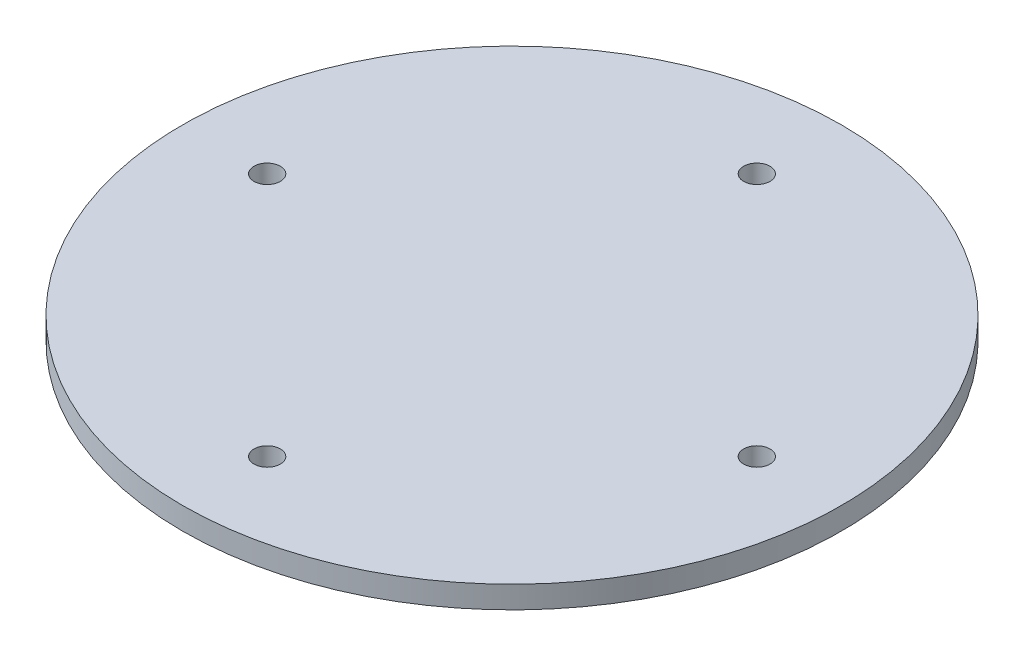
ISO-10303-21;
HEADER;
FILE_DESCRIPTION(('STEP AP214'),'2;1');
FILE_NAME('part.step','',(''),(''),'','','');
FILE_SCHEMA(('AUTOMOTIVE_DESIGN { 1 0 10303 214 1 1 1 1 }'));
ENDSEC;
DATA;
#1=APPLICATION_CONTEXT('core data for automotive mechanical design processes');
#2=APPLICATION_PROTOCOL_DEFINITION('international standard','automotive_design',2000,#1);
#3=PRODUCT_CONTEXT('',#1,'mechanical');
#4=PRODUCT('Part','Part','',(#3));
#5=PRODUCT_RELATED_PRODUCT_CATEGORY('part','',(#4));
#6=PRODUCT_DEFINITION_FORMATION('','',#4);
#7=PRODUCT_DEFINITION_CONTEXT('part definition',#1,'design');
#8=PRODUCT_DEFINITION('design','',#6,#7);
#9=PRODUCT_DEFINITION_SHAPE('','',#8);
#10=(LENGTH_UNIT() NAMED_UNIT(*) SI_UNIT(.MILLI.,.METRE.));
#11=(NAMED_UNIT(*) PLANE_ANGLE_UNIT() SI_UNIT($,.RADIAN.));
#12=(NAMED_UNIT(*) SI_UNIT($,.STERADIAN.) SOLID_ANGLE_UNIT());
#13=UNCERTAINTY_MEASURE_WITH_UNIT(LENGTH_MEASURE(1.E-05),#10,'distance_accuracy_value','');
#14=(GEOMETRIC_REPRESENTATION_CONTEXT(3) GLOBAL_UNCERTAINTY_ASSIGNED_CONTEXT((#13)) GLOBAL_UNIT_ASSIGNED_CONTEXT((#10,
#11,#12)) REPRESENTATION_CONTEXT('',''));
#15=CARTESIAN_POINT('',(0.,0.,0.));
#16=DIRECTION('',(0.,0.,1.));
#17=DIRECTION('',(1.,0.,0.));
#18=AXIS2_PLACEMENT_3D('',#15,#16,#17);
#19=CARTESIAN_POINT('',(0.,3.,0.));
#20=DIRECTION('',(0.,-1.,0.));
#21=DIRECTION('',(0.,0.,-1.));
#22=AXIS2_PLACEMENT_3D('',#19,#20,#21);
#23=CYLINDRICAL_SURFACE('',#22,44.45);
#24=CARTESIAN_POINT('',(0.,3.,0.));
#25=DIRECTION('',(0.,1.,0.));
#26=DIRECTION('',(0.,0.,1.));
#27=AXIS2_PLACEMENT_3D('',#24,#25,#26);
#28=CIRCLE('',#27,44.45);
#29=CARTESIAN_POINT('',(0.,3.,44.45));
#30=VERTEX_POINT('',#29);
#31=EDGE_CURVE('E10',#30,#30,#28,.T.);
#32=ORIENTED_EDGE('',*,*,#31,.F.);
#33=EDGE_LOOP('',(#32));
#34=FACE_BOUND('',#33,.T.);
#35=CARTESIAN_POINT('',(0.,0.,0.));
#36=DIRECTION('',(0.,1.,0.));
#37=DIRECTION('',(0.,0.,1.));
#38=AXIS2_PLACEMENT_3D('',#35,#36,#37);
#39=CIRCLE('',#38,44.45);
#40=CARTESIAN_POINT('',(0.,0.,44.45));
#41=VERTEX_POINT('',#40);
#42=EDGE_CURVE('E38',#41,#41,#39,.T.);
#43=ORIENTED_EDGE('',*,*,#42,.T.);
#44=EDGE_LOOP('',(#43));
#45=FACE_BOUND('',#44,.T.);
#46=ADVANCED_FACE('F35',(#34,#45),#23,.T.);
#47=CARTESIAN_POINT('',(0.,3.,0.));
#48=DIRECTION('',(0.,1.,0.));
#49=DIRECTION('',(0.,0.,1.));
#50=AXIS2_PLACEMENT_3D('',#47,#48,#49);
#51=PLANE('',#50);
#52=CARTESIAN_POINT('',(3.45866141425801E-13,3.,-33.02));
#53=DIRECTION('',(0.,1.,0.));
#54=DIRECTION('',(1.,0.,0.));
#55=AXIS2_PLACEMENT_3D('',#52,#53,#54);
#56=CIRCLE('',#55,1.778);
#57=CARTESIAN_POINT('',(1.77800000000035,3.,-33.02));
#58=VERTEX_POINT('',#57);
#59=EDGE_CURVE('E65',#58,#58,#56,.T.);
#60=ORIENTED_EDGE('',*,*,#59,.F.);
#61=EDGE_LOOP('',(#60));
#62=FACE_BOUND('',#61,.T.);
#63=CARTESIAN_POINT('',(-33.02,3.,0.));
#64=DIRECTION('',(0.,1.,0.));
#65=DIRECTION('',(0.,0.,-1.));
#66=AXIS2_PLACEMENT_3D('',#63,#64,#65);
#67=CIRCLE('',#66,1.778);
#68=CARTESIAN_POINT('',(-33.02,3.,-1.778));
#69=VERTEX_POINT('',#68);
#70=EDGE_CURVE('E59',#69,#69,#67,.T.);
#71=ORIENTED_EDGE('',*,*,#70,.F.);
#72=EDGE_LOOP('',(#71));
#73=FACE_BOUND('',#72,.T.);
#74=CARTESIAN_POINT('',(-1.152887138086E-13,3.,33.02));
#75=DIRECTION('',(0.,1.,0.));
#76=DIRECTION('',(-1.,0.,0.));
#77=AXIS2_PLACEMENT_3D('',#74,#75,#76);
#78=CIRCLE('',#77,1.778);
#79=CARTESIAN_POINT('',(-1.77800000000012,3.,33.02));
#80=VERTEX_POINT('',#79);
#81=EDGE_CURVE('E53',#80,#80,#78,.T.);
#82=ORIENTED_EDGE('',*,*,#81,.F.);
#83=EDGE_LOOP('',(#82));
#84=FACE_BOUND('',#83,.T.);
#85=CARTESIAN_POINT('',(33.02,3.,0.));
#86=DIRECTION('',(0.,1.,0.));
#87=DIRECTION('',(0.,0.,1.));
#88=AXIS2_PLACEMENT_3D('',#85,#86,#87);
#89=CIRCLE('',#88,1.778);
#90=CARTESIAN_POINT('',(33.02,3.,1.778));
#91=VERTEX_POINT('',#90);
#92=EDGE_CURVE('E47',#91,#91,#89,.T.);
#93=ORIENTED_EDGE('',*,*,#92,.F.);
#94=EDGE_LOOP('',(#93));
#95=FACE_BOUND('',#94,.T.);
#96=ORIENTED_EDGE('',*,*,#31,.T.);
#97=EDGE_LOOP('',(#96));
#98=FACE_BOUND('',#97,.T.);
#99=ADVANCED_FACE('F81',(#62,#73,#84,#95,#98),#51,.T.);
#100=CARTESIAN_POINT('',(0.,0.,0.));
#101=DIRECTION('',(0.,1.,0.));
#102=DIRECTION('',(0.,0.,1.));
#103=AXIS2_PLACEMENT_3D('',#100,#101,#102);
#104=PLANE('',#103);
#105=CARTESIAN_POINT('',(3.45866141425801E-13,0.,-33.02));
#106=DIRECTION('',(0.,1.,0.));
#107=DIRECTION('',(1.,0.,0.));
#108=AXIS2_PLACEMENT_3D('',#105,#106,#107);
#109=CIRCLE('',#108,1.778);
#110=CARTESIAN_POINT('',(1.77800000000035,0.,-33.02));
#111=VERTEX_POINT('',#110);
#112=EDGE_CURVE('E62',#111,#111,#109,.T.);
#113=ORIENTED_EDGE('',*,*,#112,.T.);
#114=EDGE_LOOP('',(#113));
#115=FACE_BOUND('',#114,.T.);
#116=CARTESIAN_POINT('',(-33.02,0.,0.));
#117=DIRECTION('',(0.,1.,0.));
#118=DIRECTION('',(0.,0.,-1.));
#119=AXIS2_PLACEMENT_3D('',#116,#117,#118);
#120=CIRCLE('',#119,1.778);
#121=CARTESIAN_POINT('',(-33.02,0.,-1.778));
#122=VERTEX_POINT('',#121);
#123=EDGE_CURVE('E56',#122,#122,#120,.T.);
#124=ORIENTED_EDGE('',*,*,#123,.T.);
#125=EDGE_LOOP('',(#124));
#126=FACE_BOUND('',#125,.T.);
#127=CARTESIAN_POINT('',(-1.152887138086E-13,0.,33.02));
#128=DIRECTION('',(0.,1.,0.));
#129=DIRECTION('',(-1.,0.,0.));
#130=AXIS2_PLACEMENT_3D('',#127,#128,#129);
#131=CIRCLE('',#130,1.778);
#132=CARTESIAN_POINT('',(-1.77800000000012,0.,33.02));
#133=VERTEX_POINT('',#132);
#134=EDGE_CURVE('E50',#133,#133,#131,.T.);
#135=ORIENTED_EDGE('',*,*,#134,.T.);
#136=EDGE_LOOP('',(#135));
#137=FACE_BOUND('',#136,.T.);
#138=CARTESIAN_POINT('',(33.02,0.,0.));
#139=DIRECTION('',(0.,1.,0.));
#140=DIRECTION('',(0.,0.,1.));
#141=AXIS2_PLACEMENT_3D('',#138,#139,#140);
#142=CIRCLE('',#141,1.778);
#143=CARTESIAN_POINT('',(33.02,0.,1.778));
#144=VERTEX_POINT('',#143);
#145=EDGE_CURVE('E45',#144,#144,#142,.T.);
#146=ORIENTED_EDGE('',*,*,#145,.T.);
#147=EDGE_LOOP('',(#146));
#148=FACE_BOUND('',#147,.T.);
#149=ORIENTED_EDGE('',*,*,#42,.F.);
#150=EDGE_LOOP('',(#149));
#151=FACE_BOUND('',#150,.T.);
#152=ADVANCED_FACE('F71',(#115,#126,#137,#148,#151),#104,.F.);
#153=CARTESIAN_POINT('',(33.02,0.,0.));
#154=DIRECTION('',(0.,1.,0.));
#155=DIRECTION('',(0.,0.,1.));
#156=AXIS2_PLACEMENT_3D('',#153,#154,#155);
#157=CYLINDRICAL_SURFACE('',#156,1.778);
#158=ORIENTED_EDGE('',*,*,#145,.F.);
#159=EDGE_LOOP('',(#158));
#160=FACE_BOUND('',#159,.T.);
#161=ORIENTED_EDGE('',*,*,#92,.T.);
#162=EDGE_LOOP('',(#161));
#163=FACE_BOUND('',#162,.T.);
#164=ADVANCED_FACE('F91',(#160,#163),#157,.F.);
#165=CARTESIAN_POINT('',(-1.152887138086E-13,0.,33.02));
#166=DIRECTION('',(0.,1.,0.));
#167=DIRECTION('',(0.,0.,1.));
#168=AXIS2_PLACEMENT_3D('',#165,#166,#167);
#169=CYLINDRICAL_SURFACE('',#168,1.778);
#170=ORIENTED_EDGE('',*,*,#134,.F.);
#171=EDGE_LOOP('',(#170));
#172=FACE_BOUND('',#171,.T.);
#173=ORIENTED_EDGE('',*,*,#81,.T.);
#174=EDGE_LOOP('',(#173));
#175=FACE_BOUND('',#174,.T.);
#176=ADVANCED_FACE('F93',(#172,#175),#169,.F.);
#177=CARTESIAN_POINT('',(-33.02,0.,0.));
#178=DIRECTION('',(0.,1.,0.));
#179=DIRECTION('',(0.,0.,1.));
#180=AXIS2_PLACEMENT_3D('',#177,#178,#179);
#181=CYLINDRICAL_SURFACE('',#180,1.778);
#182=ORIENTED_EDGE('',*,*,#123,.F.);
#183=EDGE_LOOP('',(#182));
#184=FACE_BOUND('',#183,.T.);
#185=ORIENTED_EDGE('',*,*,#70,.T.);
#186=EDGE_LOOP('',(#185));
#187=FACE_BOUND('',#186,.T.);
#188=ADVANCED_FACE('F77',(#184,#187),#181,.F.);
#189=CARTESIAN_POINT('',(3.45866141425801E-13,0.,-33.02));
#190=DIRECTION('',(0.,1.,0.));
#191=DIRECTION('',(0.,0.,1.));
#192=AXIS2_PLACEMENT_3D('',#189,#190,#191);
#193=CYLINDRICAL_SURFACE('',#192,1.778);
#194=ORIENTED_EDGE('',*,*,#112,.F.);
#195=EDGE_LOOP('',(#194));
#196=FACE_BOUND('',#195,.T.);
#197=ORIENTED_EDGE('',*,*,#59,.T.);
#198=EDGE_LOOP('',(#197));
#199=FACE_BOUND('',#198,.T.);
#200=ADVANCED_FACE('F74',(#196,#199),#193,.F.);
#201=CLOSED_SHELL('',(#46,#99,#152,#164,#176,#188,#200));
#202=MANIFOLD_SOLID_BREP('B2',#201);
#203=ADVANCED_BREP_SHAPE_REPRESENTATION('',(#18,#202),#14);
#204=SHAPE_DEFINITION_REPRESENTATION(#9,#203);
ENDSEC;
END-ISO-10303-21;
